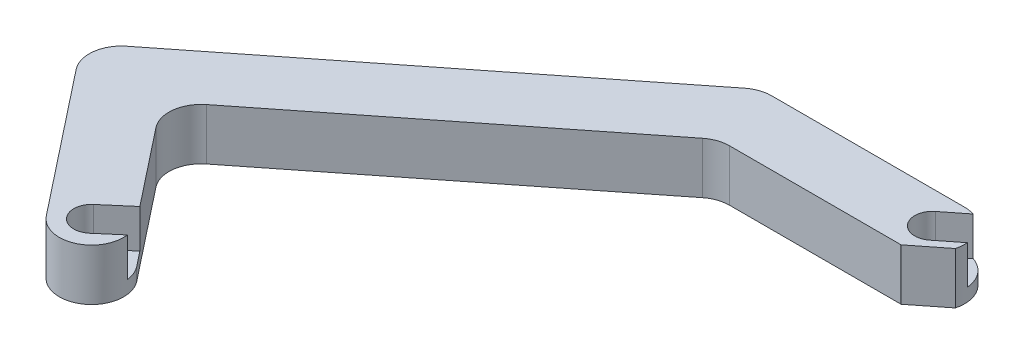
ISO-10303-21;
HEADER;
FILE_DESCRIPTION(('STEP AP214'),'2;1');
FILE_NAME('part.step','',(''),(''),'','','');
FILE_SCHEMA(('AUTOMOTIVE_DESIGN { 1 0 10303 214 1 1 1 1 }'));
ENDSEC;
DATA;
#1=APPLICATION_CONTEXT('core data for automotive mechanical design processes');
#2=APPLICATION_PROTOCOL_DEFINITION('international standard','automotive_design',2000,#1);
#3=PRODUCT_CONTEXT('',#1,'mechanical');
#4=PRODUCT('Part','Part','',(#3));
#5=PRODUCT_RELATED_PRODUCT_CATEGORY('part','',(#4));
#6=PRODUCT_DEFINITION_FORMATION('','',#4);
#7=PRODUCT_DEFINITION_CONTEXT('part definition',#1,'design');
#8=PRODUCT_DEFINITION('design','',#6,#7);
#9=PRODUCT_DEFINITION_SHAPE('','',#8);
#10=(LENGTH_UNIT() NAMED_UNIT(*) SI_UNIT(.MILLI.,.METRE.));
#11=(NAMED_UNIT(*) PLANE_ANGLE_UNIT() SI_UNIT($,.RADIAN.));
#12=(NAMED_UNIT(*) SI_UNIT($,.STERADIAN.) SOLID_ANGLE_UNIT());
#13=UNCERTAINTY_MEASURE_WITH_UNIT(LENGTH_MEASURE(1.E-05),#10,'distance_accuracy_value','');
#14=(GEOMETRIC_REPRESENTATION_CONTEXT(3) GLOBAL_UNCERTAINTY_ASSIGNED_CONTEXT((#13)) GLOBAL_UNIT_ASSIGNED_CONTEXT((#10,
#11,#12)) REPRESENTATION_CONTEXT('',''));
#15=CARTESIAN_POINT('',(0.,0.,0.));
#16=DIRECTION('',(0.,0.,1.));
#17=DIRECTION('',(1.,0.,0.));
#18=AXIS2_PLACEMENT_3D('',#15,#16,#17);
#19=CARTESIAN_POINT('',(-7.71252727608147,8.,-1.5));
#20=DIRECTION('',(0.,-1.,0.));
#21=DIRECTION('',(0.,0.,-1.));
#22=AXIS2_PLACEMENT_3D('',#19,#20,#21);
#23=CYLINDRICAL_SURFACE('',#22,5.);
#24=DIRECTION('',(0.,1.,0.));
#25=VECTOR('',#24,1.);
#26=CARTESIAN_POINT('',(-10.810748718823,-97.8975899405953,-5.4244138277885));
#27=LINE('',#26,#25);
#28=CARTESIAN_POINT('',(-10.8107487188229,0.,-5.42441382778842));
#29=VERTEX_POINT('',#28);
#30=CARTESIAN_POINT('',(-10.8107487188229,8.,-5.42441382778842));
#31=VERTEX_POINT('',#30);
#32=EDGE_CURVE('E285',#29,#31,#27,.T.);
#33=ORIENTED_EDGE('',*,*,#32,.T.);
#34=CARTESIAN_POINT('',(-7.71252727608147,8.,-1.5));
#35=DIRECTION('',(0.,1.,0.));
#36=DIRECTION('',(0.,0.,1.));
#37=AXIS2_PLACEMENT_3D('',#34,#35,#36);
#38=CIRCLE('',#37,5.);
#39=CARTESIAN_POINT('',(-7.71252727608147,8.,-6.5));
#40=VERTEX_POINT('',#39);
#41=EDGE_CURVE('E350',#40,#31,#38,.T.);
#42=ORIENTED_EDGE('',*,*,#41,.F.);
#43=DIRECTION('',(0.,-1.,0.));
#44=VECTOR('',#43,1.);
#45=CARTESIAN_POINT('',(-7.71252727608147,8.,-6.5));
#46=LINE('',#45,#44);
#47=CARTESIAN_POINT('',(-7.71252727608147,0.,-6.5));
#48=VERTEX_POINT('',#47);
#49=EDGE_CURVE('E367',#40,#48,#46,.T.);
#50=ORIENTED_EDGE('',*,*,#49,.T.);
#51=CARTESIAN_POINT('',(-7.71252727608147,0.,-1.5));
#52=DIRECTION('',(0.,1.,0.));
#53=DIRECTION('',(0.,0.,1.));
#54=AXIS2_PLACEMENT_3D('',#51,#52,#53);
#55=CIRCLE('',#54,5.);
#56=EDGE_CURVE('E346',#48,#29,#55,.T.);
#57=ORIENTED_EDGE('',*,*,#56,.T.);
#58=EDGE_LOOP('',(#33,#42,#50,#57));
#59=FACE_BOUND('',#58,.T.);
#60=ADVANCED_FACE('F38',(#59),#23,.T.);
#61=CARTESIAN_POINT('',(22.2874727239185,8.,-1.5));
#62=DIRECTION('',(0.,-1.,0.));
#63=DIRECTION('',(0.,0.,-1.));
#64=AXIS2_PLACEMENT_3D('',#61,#62,#63);
#65=CYLINDRICAL_SURFACE('',#64,5.);
#66=CARTESIAN_POINT('',(22.2874727239185,8.,-1.5));
#67=DIRECTION('',(0.,1.,0.));
#68=DIRECTION('',(0.,0.,1.));
#69=AXIS2_PLACEMENT_3D('',#66,#67,#68);
#70=CIRCLE('',#69,5.);
#71=CARTESIAN_POINT('',(27.1206981747848,8.,-0.219401803414158));
#72=VERTEX_POINT('',#71);
#73=CARTESIAN_POINT('',(27.26902623573,8.,-1.92909743527414));
#74=VERTEX_POINT('',#73);
#75=EDGE_CURVE('E364',#72,#74,#70,.T.);
#76=ORIENTED_EDGE('',*,*,#75,.F.);
#77=DIRECTION('',(0.,-1.,0.));
#78=VECTOR('',#77,1.);
#79=CARTESIAN_POINT('',(27.1206981747848,8.,-0.219401803414157));
#80=LINE('',#79,#78);
#81=CARTESIAN_POINT('',(27.1206981747848,0.,-0.219401803414158));
#82=VERTEX_POINT('',#81);
#83=EDGE_CURVE('E200',#72,#82,#80,.T.);
#84=ORIENTED_EDGE('',*,*,#83,.T.);
#85=CARTESIAN_POINT('',(22.2874727239185,0.,-1.5));
#86=DIRECTION('',(0.,1.,0.));
#87=DIRECTION('',(0.,0.,1.));
#88=AXIS2_PLACEMENT_3D('',#85,#86,#87);
#89=CIRCLE('',#88,5.);
#90=CARTESIAN_POINT('',(22.2874727239185,0.,-6.5));
#91=VERTEX_POINT('',#90);
#92=EDGE_CURVE('E373',#82,#91,#89,.T.);
#93=ORIENTED_EDGE('',*,*,#92,.T.);
#94=DIRECTION('',(0.,-1.,0.));
#95=VECTOR('',#94,1.);
#96=CARTESIAN_POINT('',(22.2874727239185,8.,-6.5));
#97=LINE('',#96,#95);
#98=CARTESIAN_POINT('',(22.2874727239185,8.,-6.5));
#99=VERTEX_POINT('',#98);
#100=EDGE_CURVE('E383',#99,#91,#97,.T.);
#101=ORIENTED_EDGE('',*,*,#100,.F.);
#102=CARTESIAN_POINT('',(23.8609826487144,8.,-6.2459526458414));
#103=VERTEX_POINT('',#102);
#104=EDGE_CURVE('E358',#103,#99,#70,.T.);
#105=ORIENTED_EDGE('',*,*,#104,.F.);
#106=DIRECTION('',(0.,-1.,0.));
#107=VECTOR('',#106,1.);
#108=CARTESIAN_POINT('',(23.8609826487144,8.,-6.2459526458414));
#109=LINE('',#108,#107);
#110=CARTESIAN_POINT('',(23.8609826487144,2.,-6.2459526458414));
#111=VERTEX_POINT('',#110);
#112=EDGE_CURVE('E337',#103,#111,#109,.T.);
#113=ORIENTED_EDGE('',*,*,#112,.T.);
#114=CARTESIAN_POINT('',(22.2874727239185,2.,-1.5));
#115=DIRECTION('',(0.,-1.,0.));
#116=DIRECTION('',(0.,0.,-1.));
#117=AXIS2_PLACEMENT_3D('',#114,#115,#116);
#118=CIRCLE('',#117,5.);
#119=CARTESIAN_POINT('',(27.26902623573,2.,-1.92909743527414));
#120=VERTEX_POINT('',#119);
#121=EDGE_CURVE('E326',#111,#120,#118,.T.);
#122=ORIENTED_EDGE('',*,*,#121,.T.);
#123=DIRECTION('',(0.,-1.,0.));
#124=VECTOR('',#123,1.);
#125=CARTESIAN_POINT('',(27.26902623573,8.,-1.92909743527414));
#126=LINE('',#125,#124);
#127=EDGE_CURVE('E333',#120,#74,#126,.F.);
#128=ORIENTED_EDGE('',*,*,#127,.T.);
#129=EDGE_LOOP('',(#76,#84,#93,#101,#105,#113,#122,#128));
#130=FACE_BOUND('',#129,.T.);
#131=ADVANCED_FACE('F470',(#130),#65,.T.);
#132=CARTESIAN_POINT('',(-7.71252727608147,8.,-1.5));
#133=DIRECTION('',(0.,1.,0.));
#134=DIRECTION('',(0.,0.,1.));
#135=AXIS2_PLACEMENT_3D('',#132,#133,#134);
#136=PLANE('',#135);
#137=DIRECTION('',(-0.759510029167528,0.,0.650495592294014));
#138=VECTOR('',#137,1.);
#139=CARTESIAN_POINT('',(-45.7547120012071,8.,60.7956937712693));
#140=LINE('',#139,#138);
#141=CARTESIAN_POINT('',(-41.8706492419235,8.,57.4691205752885));
#142=VERTEX_POINT('',#141);
#143=CARTESIAN_POINT('',(-45.7547120012071,8.,60.7956937712693));
#144=VERTEX_POINT('',#143);
#145=EDGE_CURVE('E492',#142,#144,#140,.T.);
#146=ORIENTED_EDGE('',*,*,#145,.F.);
#147=DIRECTION('',(-0.619644288548294,0.,-0.784882765557684));
#148=VECTOR('',#147,1.);
#149=CARTESIAN_POINT('',(-40.0414352946101,8.,59.7861249087386));
#150=LINE('',#149,#148);
#151=CARTESIAN_POINT('',(-51.2384075886778,8.,45.6032933351112));
#152=VERTEX_POINT('',#151);
#153=EDGE_CURVE('E270',#142,#152,#150,.T.);
#154=ORIENTED_EDGE('',*,*,#153,.T.);
#155=CARTESIAN_POINT('',(-47.3139937608894,8.00000000000001,42.5050718923698));
#156=DIRECTION('',(0.,1.,0.));
#157=DIRECTION('',(0.,0.,1.));
#158=AXIS2_PLACEMENT_3D('',#155,#156,#157);
#159=CIRCLE('',#158,5.);
#160=CARTESIAN_POINT('',(-50.4122152036309,8.,38.5806580645813));
#161=VERTEX_POINT('',#160);
#162=EDGE_CURVE('E47',#152,#161,#159,.F.);
#163=ORIENTED_EDGE('',*,*,#162,.T.);
#164=DIRECTION('',(0.784882765557684,0.,-0.619644288548293));
#165=VECTOR('',#164,1.);
#166=CARTESIAN_POINT('',(-4.61430583334,8.,2.42441382778842));
#167=LINE('',#166,#165);
#168=CARTESIAN_POINT('',(-7.33912413649533,8.,4.57558617221158));
#169=VERTEX_POINT('',#168);
#170=EDGE_CURVE('E274',#161,#169,#167,.T.);
#171=ORIENTED_EDGE('',*,*,#170,.T.);
#172=CARTESIAN_POINT('',(-4.24090269375386,8.,8.5));
#173=DIRECTION('',(0.,1.,0.));
#174=DIRECTION('',(0.,0.,1.));
#175=AXIS2_PLACEMENT_3D('',#172,#173,#174);
#176=CIRCLE('',#175,5.);
#177=CARTESIAN_POINT('',(-4.24090269375386,8.,3.5));
#178=VERTEX_POINT('',#177);
#179=EDGE_CURVE('E416',#169,#178,#176,.F.);
#180=ORIENTED_EDGE('',*,*,#179,.T.);
#181=DIRECTION('',(1.,0.,0.));
#182=VECTOR('',#181,1.);
#183=CARTESIAN_POINT('',(-7.71252727608147,8.,3.5));
#184=LINE('',#183,#182);
#185=CARTESIAN_POINT('',(22.2874727239185,8.,3.5));
#186=VERTEX_POINT('',#185);
#187=EDGE_CURVE('E354',#178,#186,#184,.T.);
#188=ORIENTED_EDGE('',*,*,#187,.T.);
#189=CARTESIAN_POINT('',(22.4114015814387,8.,3.49846392787562));
#190=VERTEX_POINT('',#189);
#191=EDGE_CURVE('E359',#186,#190,#70,.T.);
#192=ORIENTED_EDGE('',*,*,#191,.T.);
#193=DIRECTION('',(-0.784882765557683,0.,0.619644288548296));
#194=VECTOR('',#193,1.);
#195=CARTESIAN_POINT('',(19.6070610004356,8.,5.71241701796303));
#196=LINE('',#195,#194);
#197=EDGE_CURVE('E300',#72,#190,#196,.T.);
#198=ORIENTED_EDGE('',*,*,#197,.F.);
#199=ORIENTED_EDGE('',*,*,#75,.T.);
#200=DIRECTION('',(0.784882765557683,0.,-0.619644288548295));
#201=VECTOR('',#200,1.);
#202=CARTESIAN_POINT('',(23.9914945174263,8.,0.658427605283628));
#203=LINE('',#202,#201);
#204=CARTESIAN_POINT('',(23.9914945174263,8.,0.658427605283628));
#205=VERTEX_POINT('',#204);
#206=EDGE_CURVE('E313',#205,#74,#203,.T.);
#207=ORIENTED_EDGE('',*,*,#206,.F.);
#208=CARTESIAN_POINT('',(22.2874727239185,8.,-1.5));
#209=DIRECTION('',(0.,1.,0.));
#210=DIRECTION('',(0.,0.,1.));
#211=AXIS2_PLACEMENT_3D('',#208,#209,#210);
#212=CIRCLE('',#211,2.75);
#213=CARTESIAN_POINT('',(20.5834509304107,8.,-3.65842760528363));
#214=VERTEX_POINT('',#213);
#215=EDGE_CURVE('E342',#214,#205,#212,.T.);
#216=ORIENTED_EDGE('',*,*,#215,.F.);
#217=DIRECTION('',(-0.784882765557683,0.,0.619644288548295));
#218=VECTOR('',#217,1.);
#219=CARTESIAN_POINT('',(20.5834509304107,8.,-3.65842760528363));
#220=LINE('',#219,#218);
#221=EDGE_CURVE('E305',#103,#214,#220,.T.);
#222=ORIENTED_EDGE('',*,*,#221,.F.);
#223=ORIENTED_EDGE('',*,*,#104,.T.);
#224=DIRECTION('',(-1.,0.,0.));
#225=VECTOR('',#224,1.);
#226=CARTESIAN_POINT('',(-7.71252727608147,8.,-6.5));
#227=LINE('',#226,#225);
#228=EDGE_CURVE('E363',#99,#40,#227,.T.);
#229=ORIENTED_EDGE('',*,*,#228,.T.);
#230=ORIENTED_EDGE('',*,*,#41,.T.);
#231=DIRECTION('',(-0.784882765557684,0.,0.619644288548294));
#232=VECTOR('',#231,1.);
#233=CARTESIAN_POINT('',(-10.8107487188231,8.,-5.42441382778858));
#234=LINE('',#233,#232);
#235=CARTESIAN_POINT('',(-64.4574857446907,8.,36.9282732944873));
#236=VERTEX_POINT('',#235);
#237=EDGE_CURVE('E278',#31,#236,#234,.T.);
#238=ORIENTED_EDGE('',*,*,#237,.T.);
#239=CARTESIAN_POINT('',(-61.3592643019492,8.,40.8526871222758));
#240=DIRECTION('',(0.,1.,0.));
#241=DIRECTION('',(0.,0.,1.));
#242=AXIS2_PLACEMENT_3D('',#239,#240,#241);
#243=CIRCLE('',#242,5.00000000000004);
#244=CARTESIAN_POINT('',(-65.2836781297377,8.,43.9509085650173));
#245=VERTEX_POINT('',#244);
#246=EDGE_CURVE('E258',#236,#245,#243,.T.);
#247=ORIENTED_EDGE('',*,*,#246,.T.);
#248=DIRECTION('',(0.619644288548294,0.,0.784882765557684));
#249=VECTOR('',#248,1.);
#250=CARTESIAN_POINT('',(-65.2836781297377,8.,43.9509085650173));
#251=LINE('',#250,#249);
#252=CARTESIAN_POINT('',(-47.8902629501869,8.,65.9825677942216));
#253=VERTEX_POINT('',#252);
#254=EDGE_CURVE('E262',#245,#253,#251,.T.);
#255=ORIENTED_EDGE('',*,*,#254,.T.);
#256=CARTESIAN_POINT('',(-43.9658491223986,8.,62.88434635148));
#257=DIRECTION('',(0.,1.,0.));
#258=DIRECTION('',(0.,0.,1.));
#259=AXIS2_PLACEMENT_3D('',#256,#257,#258);
#260=CIRCLE('',#259,5.00000000000001);
#261=CARTESIAN_POINT('',(-39.0054065883818,8.00000000000001,62.2566442989763));
#262=VERTEX_POINT('',#261);
#263=EDGE_CURVE('E266',#253,#262,#260,.T.);
#264=ORIENTED_EDGE('',*,*,#263,.T.);
#265=DIRECTION('',(0.759510029167528,0.,-0.650495592294014));
#266=VECTOR('',#265,1.);
#267=CARTESIAN_POINT('',(-42.1769862435901,8.,64.9729989316907));
#268=LINE('',#267,#266);
#269=CARTESIAN_POINT('',(-42.1769862435901,8.,64.9729989316907));
#270=VERTEX_POINT('',#269);
#271=EDGE_CURVE('E225',#270,#262,#268,.T.);
#272=ORIENTED_EDGE('',*,*,#271,.F.);
#273=CARTESIAN_POINT('',(-43.9658491223986,8.,62.88434635148));
#274=DIRECTION('',(0.,1.,0.));
#275=DIRECTION('',(0.,0.,1.));
#276=AXIS2_PLACEMENT_3D('',#273,#274,#275);
#277=CIRCLE('',#276,2.75);
#278=EDGE_CURVE('E215',#144,#270,#277,.T.);
#279=ORIENTED_EDGE('',*,*,#278,.F.);
#280=EDGE_LOOP('',(#146,#154,#163,#171,#180,#188,#192,#198,#199,#207,#216,#222,#223,#229,#230,
#238,#247,#255,#264,#272,#279));
#281=FACE_BOUND('',#280,.T.);
#282=ADVANCED_FACE('F422',(#281),#136,.T.);
#283=CARTESIAN_POINT('',(-7.71252727608147,0.,-1.5));
#284=DIRECTION('',(0.,1.,0.));
#285=DIRECTION('',(0.,0.,1.));
#286=AXIS2_PLACEMENT_3D('',#283,#284,#285);
#287=PLANE('',#286);
#288=DIRECTION('',(1.,0.,0.));
#289=VECTOR('',#288,1.);
#290=CARTESIAN_POINT('',(-7.71252727608147,0.,3.5));
#291=LINE('',#290,#289);
#292=CARTESIAN_POINT('',(-4.24090269375386,0.,3.5));
#293=VERTEX_POINT('',#292);
#294=CARTESIAN_POINT('',(22.2874727239185,0.,3.5));
#295=VERTEX_POINT('',#294);
#296=EDGE_CURVE('E370',#293,#295,#291,.T.);
#297=ORIENTED_EDGE('',*,*,#296,.F.);
#298=CARTESIAN_POINT('',(-4.24090269375386,0.,8.5));
#299=DIRECTION('',(0.,1.,0.));
#300=DIRECTION('',(0.,0.,1.));
#301=AXIS2_PLACEMENT_3D('',#298,#299,#300);
#302=CIRCLE('',#301,5.);
#303=CARTESIAN_POINT('',(-7.33912413649533,0.,4.57558617221158));
#304=VERTEX_POINT('',#303);
#305=EDGE_CURVE('E413',#293,#304,#302,.T.);
#306=ORIENTED_EDGE('',*,*,#305,.T.);
#307=DIRECTION('',(-0.784882765557685,0.,0.619644288548294));
#308=VECTOR('',#307,1.);
#309=CARTESIAN_POINT('',(-4.61430583334,0.,2.42441382778842));
#310=LINE('',#309,#308);
#311=CARTESIAN_POINT('',(-50.4122152036309,0.,38.5806580645813));
#312=VERTEX_POINT('',#311);
#313=EDGE_CURVE('E247',#304,#312,#310,.T.);
#314=ORIENTED_EDGE('',*,*,#313,.T.);
#315=CARTESIAN_POINT('',(-47.3139937608894,0.,42.5050718923698));
#316=DIRECTION('',(0.,1.,0.));
#317=DIRECTION('',(0.,0.,1.));
#318=AXIS2_PLACEMENT_3D('',#315,#316,#317);
#319=CIRCLE('',#318,5.);
#320=CARTESIAN_POINT('',(-51.2384075886778,0.,45.6032933351112));
#321=VERTEX_POINT('',#320);
#322=EDGE_CURVE('E11',#312,#321,#319,.T.);
#323=ORIENTED_EDGE('',*,*,#322,.T.);
#324=DIRECTION('',(0.619644288548294,0.,0.784882765557684));
#325=VECTOR('',#324,1.);
#326=CARTESIAN_POINT('',(-40.0414352946101,0.,59.7861249087386));
#327=LINE('',#326,#325);
#328=CARTESIAN_POINT('',(-40.0414352946101,0.,59.7861249087386));
#329=VERTEX_POINT('',#328);
#330=EDGE_CURVE('E243',#321,#329,#327,.T.);
#331=ORIENTED_EDGE('',*,*,#330,.T.);
#332=CARTESIAN_POINT('',(-43.9658491223986,0.,62.88434635148));
#333=DIRECTION('',(0.,1.,0.));
#334=DIRECTION('',(0.,0.,1.));
#335=AXIS2_PLACEMENT_3D('',#332,#333,#334);
#336=CIRCLE('',#335,5.00000000000001);
#337=CARTESIAN_POINT('',(-47.8902629501869,0.,65.9825677942216));
#338=VERTEX_POINT('',#337);
#339=EDGE_CURVE('E240',#329,#338,#336,.F.);
#340=ORIENTED_EDGE('',*,*,#339,.T.);
#341=DIRECTION('',(-0.619644288548294,0.,-0.784882765557685));
#342=VECTOR('',#341,1.);
#343=CARTESIAN_POINT('',(-65.2836781297377,0.,43.9509085650173));
#344=LINE('',#343,#342);
#345=CARTESIAN_POINT('',(-65.2836781297377,0.,43.9509085650173));
#346=VERTEX_POINT('',#345);
#347=EDGE_CURVE('E235',#338,#346,#344,.T.);
#348=ORIENTED_EDGE('',*,*,#347,.T.);
#349=CARTESIAN_POINT('',(-61.3592643019492,0.,40.8526871222758));
#350=DIRECTION('',(0.,1.,0.));
#351=DIRECTION('',(0.,0.,1.));
#352=AXIS2_PLACEMENT_3D('',#349,#350,#351);
#353=CIRCLE('',#352,5.00000000000004);
#354=CARTESIAN_POINT('',(-64.4574857446907,0.,36.9282732944873));
#355=VERTEX_POINT('',#354);
#356=EDGE_CURVE('E239',#346,#355,#353,.F.);
#357=ORIENTED_EDGE('',*,*,#356,.T.);
#358=DIRECTION('',(0.784882765557684,0.,-0.619644288548294));
#359=VECTOR('',#358,1.);
#360=CARTESIAN_POINT('',(-10.8107487188231,0.,-5.42441382778858));
#361=LINE('',#360,#359);
#362=EDGE_CURVE('E250',#355,#29,#361,.T.);
#363=ORIENTED_EDGE('',*,*,#362,.T.);
#364=ORIENTED_EDGE('',*,*,#56,.F.);
#365=DIRECTION('',(-1.,0.,0.));
#366=VECTOR('',#365,1.);
#367=CARTESIAN_POINT('',(-7.71252727608147,0.,-6.5));
#368=LINE('',#367,#366);
#369=EDGE_CURVE('E355',#91,#48,#368,.T.);
#370=ORIENTED_EDGE('',*,*,#369,.F.);
#371=ORIENTED_EDGE('',*,*,#92,.F.);
#372=DIRECTION('',(-0.784882765557683,0.,0.619644288548296));
#373=VECTOR('',#372,1.);
#374=CARTESIAN_POINT('',(19.6070610004356,0.,5.71241701796303));
#375=LINE('',#374,#373);
#376=CARTESIAN_POINT('',(22.4114015814387,0.,3.49846392787562));
#377=VERTEX_POINT('',#376);
#378=EDGE_CURVE('E301',#82,#377,#375,.T.);
#379=ORIENTED_EDGE('',*,*,#378,.T.);
#380=EDGE_CURVE('E374',#295,#377,#89,.T.);
#381=ORIENTED_EDGE('',*,*,#380,.F.);
#382=EDGE_LOOP('',(#297,#306,#314,#323,#331,#340,#348,#357,#363,#364,#370,#371,#379,#381));
#383=FACE_BOUND('',#382,.T.);
#384=CARTESIAN_POINT('',(22.2874727239185,0.,-1.5));
#385=DIRECTION('',(0.,1.,0.));
#386=DIRECTION('',(0.,0.,1.));
#387=AXIS2_PLACEMENT_3D('',#384,#385,#386);
#388=CIRCLE('',#387,2.75);
#389=CARTESIAN_POINT('',(22.2874727239185,0.,1.25));
#390=VERTEX_POINT('',#389);
#391=EDGE_CURVE('E341',#390,#390,#388,.T.);
#392=ORIENTED_EDGE('',*,*,#391,.T.);
#393=EDGE_LOOP('',(#392));
#394=FACE_BOUND('',#393,.T.);
#395=CARTESIAN_POINT('',(-43.9658491223986,0.,62.88434635148));
#396=DIRECTION('',(0.,1.,0.));
#397=DIRECTION('',(0.,0.,1.));
#398=AXIS2_PLACEMENT_3D('',#395,#396,#397);
#399=CIRCLE('',#398,2.75);
#400=CARTESIAN_POINT('',(-43.9658491223986,0.,65.63434635148));
#401=VERTEX_POINT('',#400);
#402=EDGE_CURVE('E238',#401,#401,#399,.F.);
#403=ORIENTED_EDGE('',*,*,#402,.F.);
#404=EDGE_LOOP('',(#403));
#405=FACE_BOUND('',#404,.T.);
#406=ADVANCED_FACE('F436',(#383,#394,#405),#287,.F.);
#407=CARTESIAN_POINT('',(-7.71252727608147,8.,3.5));
#408=DIRECTION('',(0.,0.,-1.));
#409=DIRECTION('',(-1.,0.,0.));
#410=AXIS2_PLACEMENT_3D('',#407,#408,#409);
#411=PLANE('',#410);
#412=ORIENTED_EDGE('',*,*,#187,.F.);
#413=DIRECTION('',(0.,-1.,0.));
#414=VECTOR('',#413,1.);
#415=CARTESIAN_POINT('',(-4.24090269375386,8.,3.5));
#416=LINE('',#415,#414);
#417=EDGE_CURVE('E199',#178,#293,#416,.T.);
#418=ORIENTED_EDGE('',*,*,#417,.T.);
#419=ORIENTED_EDGE('',*,*,#296,.T.);
#420=DIRECTION('',(0.,-1.,0.));
#421=VECTOR('',#420,1.);
#422=CARTESIAN_POINT('',(22.2874727239185,8.,3.5));
#423=LINE('',#422,#421);
#424=EDGE_CURVE('E387',#186,#295,#423,.T.);
#425=ORIENTED_EDGE('',*,*,#424,.F.);
#426=EDGE_LOOP('',(#412,#418,#419,#425));
#427=FACE_BOUND('',#426,.T.);
#428=ADVANCED_FACE('F516',(#427),#411,.F.);
#429=ORIENTED_EDGE('',*,*,#380,.T.);
#430=DIRECTION('',(0.,-1.,0.));
#431=VECTOR('',#430,1.);
#432=CARTESIAN_POINT('',(22.4114015814387,8.,3.49846392787562));
#433=LINE('',#432,#431);
#434=EDGE_CURVE('E394',#377,#190,#433,.F.);
#435=ORIENTED_EDGE('',*,*,#434,.T.);
#436=ORIENTED_EDGE('',*,*,#191,.F.);
#437=ORIENTED_EDGE('',*,*,#424,.T.);
#438=EDGE_LOOP('',(#429,#435,#436,#437));
#439=FACE_BOUND('',#438,.T.);
#440=ADVANCED_FACE('F514',(#439),#65,.T.);
#441=CARTESIAN_POINT('',(-7.71252727608147,8.,-6.5));
#442=DIRECTION('',(0.,0.,1.));
#443=DIRECTION('',(1.,0.,0.));
#444=AXIS2_PLACEMENT_3D('',#441,#442,#443);
#445=PLANE('',#444);
#446=ORIENTED_EDGE('',*,*,#369,.T.);
#447=ORIENTED_EDGE('',*,*,#49,.F.);
#448=ORIENTED_EDGE('',*,*,#228,.F.);
#449=ORIENTED_EDGE('',*,*,#100,.T.);
#450=EDGE_LOOP('',(#446,#447,#448,#449));
#451=FACE_BOUND('',#450,.T.);
#452=ADVANCED_FACE('F465',(#451),#445,.F.);
#453=CARTESIAN_POINT('',(22.2874727239185,8.,-1.5));
#454=DIRECTION('',(0.,-1.,0.));
#455=DIRECTION('',(0.,0.,-1.));
#456=AXIS2_PLACEMENT_3D('',#453,#454,#455);
#457=CYLINDRICAL_SURFACE('',#456,2.75);
#458=DIRECTION('',(0.,1.,0.));
#459=VECTOR('',#458,1.);
#460=CARTESIAN_POINT('',(20.5834509304107,2.,-3.65842760528363));
#461=LINE('',#460,#459);
#462=CARTESIAN_POINT('',(20.5834509304107,2.,-3.65842760528363));
#463=VERTEX_POINT('',#462);
#464=EDGE_CURVE('E317',#463,#214,#461,.T.);
#465=ORIENTED_EDGE('',*,*,#464,.T.);
#466=ORIENTED_EDGE('',*,*,#215,.T.);
#467=DIRECTION('',(0.,1.,0.));
#468=VECTOR('',#467,1.);
#469=CARTESIAN_POINT('',(23.9914945174263,2.,0.658427605283628));
#470=LINE('',#469,#468);
#471=CARTESIAN_POINT('',(23.9914945174263,2.,0.658427605283628));
#472=VERTEX_POINT('',#471);
#473=EDGE_CURVE('E323',#472,#205,#470,.T.);
#474=ORIENTED_EDGE('',*,*,#473,.F.);
#475=CARTESIAN_POINT('',(22.2874727239185,2.,-1.5));
#476=DIRECTION('',(0.,-1.,0.));
#477=DIRECTION('',(0.,0.,-1.));
#478=AXIS2_PLACEMENT_3D('',#475,#476,#477);
#479=CIRCLE('',#478,2.75);
#480=EDGE_CURVE('E391',#463,#472,#479,.T.);
#481=ORIENTED_EDGE('',*,*,#480,.F.);
#482=EDGE_LOOP('',(#465,#466,#474,#481));
#483=FACE_BOUND('',#482,.T.);
#484=ORIENTED_EDGE('',*,*,#391,.F.);
#485=EDGE_LOOP('',(#484));
#486=FACE_BOUND('',#485,.T.);
#487=ADVANCED_FACE('F489',(#483,#486),#457,.F.);
#488=CARTESIAN_POINT('',(20.5834509304107,2.,-3.65842760528363));
#489=DIRECTION('',(-0.619644288548295,0.,-0.784882765557683));
#490=DIRECTION('',(-0.784882765557684,0.,0.619644288548295));
#491=AXIS2_PLACEMENT_3D('',#488,#489,#490);
#492=PLANE('',#491);
#493=ORIENTED_EDGE('',*,*,#221,.T.);
#494=ORIENTED_EDGE('',*,*,#464,.F.);
#495=DIRECTION('',(-0.784882765557683,0.,0.619644288548295));
#496=VECTOR('',#495,1.);
#497=CARTESIAN_POINT('',(20.5834509304107,2.,-3.65842760528363));
#498=LINE('',#497,#496);
#499=EDGE_CURVE('E308',#111,#463,#498,.T.);
#500=ORIENTED_EDGE('',*,*,#499,.F.);
#501=ORIENTED_EDGE('',*,*,#112,.F.);
#502=EDGE_LOOP('',(#493,#494,#500,#501));
#503=FACE_BOUND('',#502,.T.);
#504=ADVANCED_FACE('F486',(#503),#492,.F.);
#505=CARTESIAN_POINT('',(23.9914945174263,2.,0.658427605283628));
#506=DIRECTION('',(0.619644288548295,0.,0.784882765557683));
#507=DIRECTION('',(0.784882765557683,0.,-0.619644288548295));
#508=AXIS2_PLACEMENT_3D('',#505,#506,#507);
#509=PLANE('',#508);
#510=DIRECTION('',(0.784882765557683,0.,-0.619644288548295));
#511=VECTOR('',#510,1.);
#512=CARTESIAN_POINT('',(23.9914945174263,2.,0.658427605283628));
#513=LINE('',#512,#511);
#514=EDGE_CURVE('E312',#472,#120,#513,.T.);
#515=ORIENTED_EDGE('',*,*,#514,.F.);
#516=ORIENTED_EDGE('',*,*,#473,.T.);
#517=ORIENTED_EDGE('',*,*,#206,.T.);
#518=ORIENTED_EDGE('',*,*,#127,.F.);
#519=EDGE_LOOP('',(#515,#516,#517,#518));
#520=FACE_BOUND('',#519,.T.);
#521=ADVANCED_FACE('F479',(#520),#509,.F.);
#522=CARTESIAN_POINT('',(0.,2.,0.));
#523=DIRECTION('',(0.,-1.,0.));
#524=DIRECTION('',(0.,0.,-1.));
#525=AXIS2_PLACEMENT_3D('',#522,#523,#524);
#526=PLANE('',#525);
#527=ORIENTED_EDGE('',*,*,#499,.T.);
#528=ORIENTED_EDGE('',*,*,#480,.T.);
#529=ORIENTED_EDGE('',*,*,#514,.T.);
#530=ORIENTED_EDGE('',*,*,#121,.F.);
#531=EDGE_LOOP('',(#527,#528,#529,#530));
#532=FACE_BOUND('',#531,.T.);
#533=ADVANCED_FACE('F483',(#532),#526,.F.);
#534=CARTESIAN_POINT('',(19.6070610004356,0.,5.71241701796303));
#535=DIRECTION('',(-0.619644288548296,0.,-0.784882765557683));
#536=DIRECTION('',(-0.784882765557683,0.,0.619644288548296));
#537=AXIS2_PLACEMENT_3D('',#534,#535,#536);
#538=PLANE('',#537);
#539=ORIENTED_EDGE('',*,*,#197,.T.);
#540=ORIENTED_EDGE('',*,*,#434,.F.);
#541=ORIENTED_EDGE('',*,*,#378,.F.);
#542=ORIENTED_EDGE('',*,*,#83,.F.);
#543=EDGE_LOOP('',(#539,#540,#541,#542));
#544=FACE_BOUND('',#543,.T.);
#545=ADVANCED_FACE('F530',(#544),#538,.F.);
#546=CARTESIAN_POINT('',(-4.61430583334,-97.8975899405953,2.42441382778842));
#547=DIRECTION('',(0.619644288548294,0.,0.784882765557685));
#548=DIRECTION('',(0.784882765557685,0.,-0.619644288548294));
#549=AXIS2_PLACEMENT_3D('',#546,#547,#548);
#550=PLANE('',#549);
#551=ORIENTED_EDGE('',*,*,#313,.F.);
#552=DIRECTION('',(0.,-1.,0.));
#553=VECTOR('',#552,1.);
#554=CARTESIAN_POINT('',(-7.33912413649533,-97.8975899405953,4.57558617221158));
#555=LINE('',#554,#553);
#556=EDGE_CURVE('E407',#304,#169,#555,.F.);
#557=ORIENTED_EDGE('',*,*,#556,.T.);
#558=ORIENTED_EDGE('',*,*,#170,.F.);
#559=DIRECTION('',(0.,1.,0.));
#560=VECTOR('',#559,1.);
#561=CARTESIAN_POINT('',(-50.4122152036309,0.,38.5806580645813));
#562=LINE('',#561,#560);
#563=EDGE_CURVE('E404',#161,#312,#562,.F.);
#564=ORIENTED_EDGE('',*,*,#563,.T.);
#565=EDGE_LOOP('',(#551,#557,#558,#564));
#566=FACE_BOUND('',#565,.T.);
#567=ADVANCED_FACE('F427',(#566),#550,.T.);
#568=CARTESIAN_POINT('',(-65.2836781297377,-97.8975899405953,43.9509085650173));
#569=DIRECTION('',(-0.784882765557685,0.,0.619644288548294));
#570=DIRECTION('',(0.619644288548294,0.,0.784882765557685));
#571=AXIS2_PLACEMENT_3D('',#568,#569,#570);
#572=PLANE('',#571);
#573=ORIENTED_EDGE('',*,*,#347,.F.);
#574=DIRECTION('',(0.,1.,0.));
#575=VECTOR('',#574,1.);
#576=CARTESIAN_POINT('',(-47.8902629501869,-97.8975899405953,65.9825677942216));
#577=LINE('',#576,#575);
#578=EDGE_CURVE('E292',#338,#253,#577,.T.);
#579=ORIENTED_EDGE('',*,*,#578,.T.);
#580=ORIENTED_EDGE('',*,*,#254,.F.);
#581=DIRECTION('',(0.,1.,0.));
#582=VECTOR('',#581,1.);
#583=CARTESIAN_POINT('',(-65.2836781297377,-97.8975899405953,43.9509085650173));
#584=LINE('',#583,#582);
#585=EDGE_CURVE('E282',#346,#245,#584,.T.);
#586=ORIENTED_EDGE('',*,*,#585,.F.);
#587=EDGE_LOOP('',(#573,#579,#580,#586));
#588=FACE_BOUND('',#587,.T.);
#589=ADVANCED_FACE('F446',(#588),#572,.T.);
#590=CARTESIAN_POINT('',(-43.9658491223986,-97.8975899405953,62.88434635148));
#591=DIRECTION('',(0.,1.,0.));
#592=DIRECTION('',(0.,0.,1.));
#593=AXIS2_PLACEMENT_3D('',#590,#591,#592);
#594=CYLINDRICAL_SURFACE('',#593,5.00000000000001);
#595=DIRECTION('',(0.,1.,0.));
#596=VECTOR('',#595,1.);
#597=CARTESIAN_POINT('',(-39.0054065883818,-97.8975899405953,62.2566442989763));
#598=LINE('',#597,#596);
#599=CARTESIAN_POINT('',(-39.0054065883818,2.,62.2566442989763));
#600=VERTEX_POINT('',#599);
#601=EDGE_CURVE('E207',#262,#600,#598,.F.);
#602=ORIENTED_EDGE('',*,*,#601,.F.);
#603=ORIENTED_EDGE('',*,*,#263,.F.);
#604=ORIENTED_EDGE('',*,*,#578,.F.);
#605=ORIENTED_EDGE('',*,*,#339,.F.);
#606=DIRECTION('',(0.,1.,0.));
#607=VECTOR('',#606,1.);
#608=CARTESIAN_POINT('',(-40.0414352946101,-97.8975899405953,59.7861249087386));
#609=LINE('',#608,#607);
#610=CARTESIAN_POINT('',(-40.0414352946101,2.,59.7861249087386));
#611=VERTEX_POINT('',#610);
#612=EDGE_CURVE('E288',#329,#611,#609,.T.);
#613=ORIENTED_EDGE('',*,*,#612,.T.);
#614=CARTESIAN_POINT('',(-43.9658491223986,2.,62.88434635148));
#615=DIRECTION('',(0.,-1.,0.));
#616=DIRECTION('',(0.,0.,-1.));
#617=AXIS2_PLACEMENT_3D('',#614,#615,#616);
#618=CIRCLE('',#617,5.00000000000001);
#619=EDGE_CURVE('E221',#600,#611,#618,.F.);
#620=ORIENTED_EDGE('',*,*,#619,.F.);
#621=EDGE_LOOP('',(#602,#603,#604,#605,#613,#620));
#622=FACE_BOUND('',#621,.T.);
#623=ADVANCED_FACE('F440',(#622),#594,.T.);
#624=CARTESIAN_POINT('',(-40.0414352946101,-97.8975899405953,59.7861249087386));
#625=DIRECTION('',(0.784882765557684,0.,-0.619644288548294));
#626=DIRECTION('',(-0.619644288548294,0.,-0.784882765557684));
#627=AXIS2_PLACEMENT_3D('',#624,#625,#626);
#628=PLANE('',#627);
#629=ORIENTED_EDGE('',*,*,#330,.F.);
#630=DIRECTION('',(0.,1.,0.));
#631=VECTOR('',#630,1.);
#632=CARTESIAN_POINT('',(-51.2384075886778,8.00000000000001,45.6032933351112));
#633=LINE('',#632,#631);
#634=EDGE_CURVE('E410',#321,#152,#633,.T.);
#635=ORIENTED_EDGE('',*,*,#634,.T.);
#636=ORIENTED_EDGE('',*,*,#153,.F.);
#637=DIRECTION('',(0.,1.,0.));
#638=VECTOR('',#637,1.);
#639=CARTESIAN_POINT('',(-41.8706492419235,-97.8975899405953,57.4691205752885));
#640=LINE('',#639,#638);
#641=CARTESIAN_POINT('',(-41.8706492419235,2.,57.4691205752885));
#642=VERTEX_POINT('',#641);
#643=EDGE_CURVE('E232',#642,#142,#640,.T.);
#644=ORIENTED_EDGE('',*,*,#643,.F.);
#645=DIRECTION('',(-0.619644288548294,0.,-0.784882765557684));
#646=VECTOR('',#645,1.);
#647=CARTESIAN_POINT('',(-40.0414352946101,2.,59.7861249087386));
#648=LINE('',#647,#646);
#649=EDGE_CURVE('E217',#611,#642,#648,.T.);
#650=ORIENTED_EDGE('',*,*,#649,.F.);
#651=ORIENTED_EDGE('',*,*,#612,.F.);
#652=EDGE_LOOP('',(#629,#635,#636,#644,#650,#651));
#653=FACE_BOUND('',#652,.T.);
#654=ADVANCED_FACE('F430',(#653),#628,.T.);
#655=CARTESIAN_POINT('',(-10.8107487188231,-97.8975899405953,-5.42441382778858));
#656=DIRECTION('',(-0.619644288548294,0.,-0.784882765557684));
#657=DIRECTION('',(-0.784882765557684,0.,0.619644288548294));
#658=AXIS2_PLACEMENT_3D('',#655,#656,#657);
#659=PLANE('',#658);
#660=ORIENTED_EDGE('',*,*,#362,.F.);
#661=DIRECTION('',(0.,1.,0.));
#662=VECTOR('',#661,1.);
#663=CARTESIAN_POINT('',(-64.4574857446907,-97.8975899405953,36.9282732944873));
#664=LINE('',#663,#662);
#665=EDGE_CURVE('E244',#355,#236,#664,.T.);
#666=ORIENTED_EDGE('',*,*,#665,.T.);
#667=ORIENTED_EDGE('',*,*,#237,.F.);
#668=ORIENTED_EDGE('',*,*,#32,.F.);
#669=EDGE_LOOP('',(#660,#666,#667,#668));
#670=FACE_BOUND('',#669,.T.);
#671=ADVANCED_FACE('F455',(#670),#659,.T.);
#672=CARTESIAN_POINT('',(-61.3592643019492,-97.8975899405953,40.8526871222758));
#673=DIRECTION('',(0.,1.,0.));
#674=DIRECTION('',(0.,0.,1.));
#675=AXIS2_PLACEMENT_3D('',#672,#673,#674);
#676=CYLINDRICAL_SURFACE('',#675,5.00000000000004);
#677=ORIENTED_EDGE('',*,*,#356,.F.);
#678=ORIENTED_EDGE('',*,*,#585,.T.);
#679=ORIENTED_EDGE('',*,*,#246,.F.);
#680=ORIENTED_EDGE('',*,*,#665,.F.);
#681=EDGE_LOOP('',(#677,#678,#679,#680));
#682=FACE_BOUND('',#681,.T.);
#683=ADVANCED_FACE('F451',(#682),#676,.T.);
#684=CARTESIAN_POINT('',(-43.9658491223986,-97.8975899405953,62.88434635148));
#685=DIRECTION('',(0.,1.,0.));
#686=DIRECTION('',(0.,0.,1.));
#687=AXIS2_PLACEMENT_3D('',#684,#685,#686);
#688=CYLINDRICAL_SURFACE('',#687,2.75);
#689=ORIENTED_EDGE('',*,*,#278,.T.);
#690=DIRECTION('',(0.,1.,0.));
#691=VECTOR('',#690,1.);
#692=CARTESIAN_POINT('',(-42.1769862435901,2.,64.9729989316907));
#693=LINE('',#692,#691);
#694=CARTESIAN_POINT('',(-42.1769862435901,2.,64.9729989316907));
#695=VERTEX_POINT('',#694);
#696=EDGE_CURVE('E204',#695,#270,#693,.T.);
#697=ORIENTED_EDGE('',*,*,#696,.F.);
#698=CARTESIAN_POINT('',(-43.9658491223986,2.,62.88434635148));
#699=DIRECTION('',(0.,-1.,0.));
#700=DIRECTION('',(0.,0.,-1.));
#701=AXIS2_PLACEMENT_3D('',#698,#699,#700);
#702=CIRCLE('',#701,2.75);
#703=CARTESIAN_POINT('',(-45.7547120012071,2.,60.7956937712693));
#704=VERTEX_POINT('',#703);
#705=EDGE_CURVE('E188',#695,#704,#702,.F.);
#706=ORIENTED_EDGE('',*,*,#705,.T.);
#707=DIRECTION('',(0.,1.,0.));
#708=VECTOR('',#707,1.);
#709=CARTESIAN_POINT('',(-45.7547120012071,2.,60.7956937712693));
#710=LINE('',#709,#708);
#711=EDGE_CURVE('E209',#704,#144,#710,.T.);
#712=ORIENTED_EDGE('',*,*,#711,.T.);
#713=EDGE_LOOP('',(#689,#697,#706,#712));
#714=FACE_BOUND('',#713,.T.);
#715=ORIENTED_EDGE('',*,*,#402,.T.);
#716=EDGE_LOOP('',(#715));
#717=FACE_BOUND('',#716,.T.);
#718=ADVANCED_FACE('F212',(#714,#717),#688,.F.);
#719=CARTESIAN_POINT('',(0.,2.,0.));
#720=DIRECTION('',(0.,-1.,0.));
#721=DIRECTION('',(0.,0.,-1.));
#722=AXIS2_PLACEMENT_3D('',#719,#720,#721);
#723=PLANE('',#722);
#724=ORIENTED_EDGE('',*,*,#619,.T.);
#725=ORIENTED_EDGE('',*,*,#649,.T.);
#726=DIRECTION('',(-0.759510029167528,0.,0.650495592294014));
#727=VECTOR('',#726,1.);
#728=CARTESIAN_POINT('',(-45.7547120012071,2.,60.7956937712693));
#729=LINE('',#728,#727);
#730=EDGE_CURVE('E194',#642,#704,#729,.T.);
#731=ORIENTED_EDGE('',*,*,#730,.T.);
#732=ORIENTED_EDGE('',*,*,#705,.F.);
#733=DIRECTION('',(0.759510029167528,0.,-0.650495592294014));
#734=VECTOR('',#733,1.);
#735=CARTESIAN_POINT('',(-42.1769862435901,2.,64.9729989316907));
#736=LINE('',#735,#734);
#737=EDGE_CURVE('E191',#695,#600,#736,.T.);
#738=ORIENTED_EDGE('',*,*,#737,.T.);
#739=EDGE_LOOP('',(#724,#725,#731,#732,#738));
#740=FACE_BOUND('',#739,.T.);
#741=ADVANCED_FACE('F190',(#740),#723,.F.);
#742=CARTESIAN_POINT('',(-45.7547120012071,2.,60.7956937712693));
#743=DIRECTION('',(-0.650495592294014,0.,-0.759510029167528));
#744=DIRECTION('',(-0.759510029167528,0.,0.650495592294014));
#745=AXIS2_PLACEMENT_3D('',#742,#743,#744);
#746=PLANE('',#745);
#747=ORIENTED_EDGE('',*,*,#643,.T.);
#748=ORIENTED_EDGE('',*,*,#145,.T.);
#749=ORIENTED_EDGE('',*,*,#711,.F.);
#750=ORIENTED_EDGE('',*,*,#730,.F.);
#751=EDGE_LOOP('',(#747,#748,#749,#750));
#752=FACE_BOUND('',#751,.T.);
#753=ADVANCED_FACE('F497',(#752),#746,.F.);
#754=CARTESIAN_POINT('',(-42.1769862435901,2.,64.9729989316907));
#755=DIRECTION('',(0.650495592294015,0.,0.759510029167528));
#756=DIRECTION('',(0.759510029167528,0.,-0.650495592294015));
#757=AXIS2_PLACEMENT_3D('',#754,#755,#756);
#758=PLANE('',#757);
#759=ORIENTED_EDGE('',*,*,#601,.T.);
#760=ORIENTED_EDGE('',*,*,#737,.F.);
#761=ORIENTED_EDGE('',*,*,#696,.T.);
#762=ORIENTED_EDGE('',*,*,#271,.T.);
#763=EDGE_LOOP('',(#759,#760,#761,#762));
#764=FACE_BOUND('',#763,.T.);
#765=ADVANCED_FACE('F203',(#764),#758,.F.);
#766=CARTESIAN_POINT('',(-4.24090269375386,8.,8.5));
#767=DIRECTION('',(0.,-1.,0.));
#768=DIRECTION('',(0.,0.,-1.));
#769=AXIS2_PLACEMENT_3D('',#766,#767,#768);
#770=CYLINDRICAL_SURFACE('',#769,5.);
#771=ORIENTED_EDGE('',*,*,#179,.F.);
#772=ORIENTED_EDGE('',*,*,#556,.F.);
#773=ORIENTED_EDGE('',*,*,#305,.F.);
#774=ORIENTED_EDGE('',*,*,#417,.F.);
#775=EDGE_LOOP('',(#771,#772,#773,#774));
#776=FACE_BOUND('',#775,.T.);
#777=ADVANCED_FACE('F504',(#776),#770,.F.);
#778=CARTESIAN_POINT('',(-47.3139937608894,-97.8975899405953,42.5050718923698));
#779=DIRECTION('',(0.,-1.,0.));
#780=DIRECTION('',(0.,0.,-1.));
#781=AXIS2_PLACEMENT_3D('',#778,#779,#780);
#782=CYLINDRICAL_SURFACE('',#781,5.);
#783=ORIENTED_EDGE('',*,*,#322,.F.);
#784=ORIENTED_EDGE('',*,*,#563,.F.);
#785=ORIENTED_EDGE('',*,*,#162,.F.);
#786=ORIENTED_EDGE('',*,*,#634,.F.);
#787=EDGE_LOOP('',(#783,#784,#785,#786));
#788=FACE_BOUND('',#787,.T.);
#789=ADVANCED_FACE('F40',(#788),#782,.F.);
#790=CLOSED_SHELL('',(#60,#131,#282,#406,#428,#440,#452,#487,#504,#521,#533,#545,#567,#589,#623,
#654,#671,#683,#718,#741,#753,#765,#777,#789));
#791=MANIFOLD_SOLID_BREP('B2',#790);
#792=ADVANCED_BREP_SHAPE_REPRESENTATION('',(#18,#791),#14);
#793=SHAPE_DEFINITION_REPRESENTATION(#9,#792);
ENDSEC;
END-ISO-10303-21;
